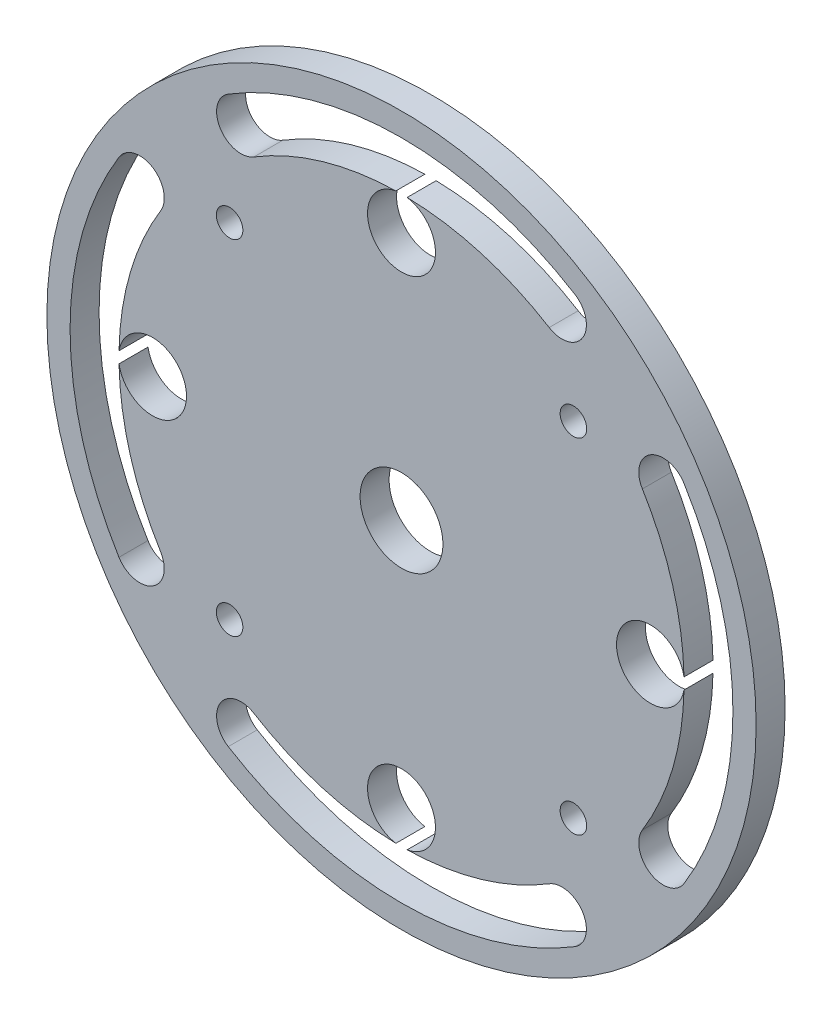
ISO-10303-21;
HEADER;
FILE_DESCRIPTION(('STEP AP214'),'2;1');
FILE_NAME('part.step','',(''),(''),'','','');
FILE_SCHEMA(('AUTOMOTIVE_DESIGN { 1 0 10303 214 1 1 1 1 }'));
ENDSEC;
DATA;
#1=APPLICATION_CONTEXT('core data for automotive mechanical design processes');
#2=APPLICATION_PROTOCOL_DEFINITION('international standard','automotive_design',2000,#1);
#3=PRODUCT_CONTEXT('',#1,'mechanical');
#4=PRODUCT('Part','Part','',(#3));
#5=PRODUCT_RELATED_PRODUCT_CATEGORY('part','',(#4));
#6=PRODUCT_DEFINITION_FORMATION('','',#4);
#7=PRODUCT_DEFINITION_CONTEXT('part definition',#1,'design');
#8=PRODUCT_DEFINITION('design','',#6,#7);
#9=PRODUCT_DEFINITION_SHAPE('','',#8);
#10=(LENGTH_UNIT() NAMED_UNIT(*) SI_UNIT(.MILLI.,.METRE.));
#11=(NAMED_UNIT(*) PLANE_ANGLE_UNIT() SI_UNIT($,.RADIAN.));
#12=(NAMED_UNIT(*) SI_UNIT($,.STERADIAN.) SOLID_ANGLE_UNIT());
#13=UNCERTAINTY_MEASURE_WITH_UNIT(LENGTH_MEASURE(1.E-05),#10,'distance_accuracy_value','');
#14=(GEOMETRIC_REPRESENTATION_CONTEXT(3) GLOBAL_UNCERTAINTY_ASSIGNED_CONTEXT((#13)) GLOBAL_UNIT_ASSIGNED_CONTEXT((#10,
#11,#12)) REPRESENTATION_CONTEXT('',''));
#15=CARTESIAN_POINT('',(0.,0.,0.));
#16=DIRECTION('',(0.,0.,1.));
#17=DIRECTION('',(1.,0.,0.));
#18=AXIS2_PLACEMENT_3D('',#15,#16,#17);
#19=CARTESIAN_POINT('',(0.,0.,48.5));
#20=DIRECTION('',(0.,0.,1.));
#21=DIRECTION('',(1.,0.,0.));
#22=AXIS2_PLACEMENT_3D('',#19,#20,#21);
#23=PLANE('',#22);
#24=CARTESIAN_POINT('',(0.,0.,48.5));
#25=DIRECTION('',(0.,0.,-1.));
#26=DIRECTION('',(-1.,0.,0.));
#27=AXIS2_PLACEMENT_3D('',#24,#25,#26);
#28=CIRCLE('',#27,5.);
#29=CARTESIAN_POINT('',(-5.,0.,48.5));
#30=VERTEX_POINT('',#29);
#31=EDGE_CURVE('E767',#30,#30,#28,.T.);
#32=ORIENTED_EDGE('',*,*,#31,.T.);
#33=EDGE_LOOP('',(#32));
#34=FACE_BOUND('',#33,.T.);
#35=CARTESIAN_POINT('',(-31.585125,19.3670436240118,48.5));
#36=DIRECTION('',(0.,0.,1.));
#37=DIRECTION('',(1.,0.,0.));
#38=AXIS2_PLACEMENT_3D('',#35,#36,#37);
#39=CIRCLE('',#38,2.95);
#40=CARTESIAN_POINT('',(-34.1,20.9090889328062,48.5));
#41=VERTEX_POINT('',#40);
#42=CARTESIAN_POINT('',(-29.07025,17.8249983152173,48.5));
#43=VERTEX_POINT('',#42);
#44=EDGE_CURVE('E206',#41,#43,#39,.F.);
#45=ORIENTED_EDGE('',*,*,#44,.T.);
#46=CARTESIAN_POINT('',(0.,0.,48.5));
#47=DIRECTION('',(0.,0.,1.));
#48=DIRECTION('',(1.,0.,0.));
#49=AXIS2_PLACEMENT_3D('',#46,#47,#48);
#50=CIRCLE('',#49,34.1);
#51=CARTESIAN_POINT('',(-34.0932196339434,0.679981611291357,48.5));
#52=VERTEX_POINT('',#51);
#53=EDGE_CURVE('E224',#43,#52,#50,.T.);
#54=ORIENTED_EDGE('',*,*,#53,.T.);
#55=CARTESIAN_POINT('',(-30.05,0.,48.5));
#56=DIRECTION('',(0.,0.,1.));
#57=DIRECTION('',(1.,0.,0.));
#58=AXIS2_PLACEMENT_3D('',#55,#56,#57);
#59=CIRCLE('',#58,4.1);
#60=CARTESIAN_POINT('',(-34.0932196339434,-0.679981611291435,48.5));
#61=VERTEX_POINT('',#60);
#62=EDGE_CURVE('E399',#61,#52,#59,.T.);
#63=ORIENTED_EDGE('',*,*,#62,.F.);
#64=CARTESIAN_POINT('',(0.,0.,48.5));
#65=DIRECTION('',(0.,0.,1.));
#66=DIRECTION('',(1.,0.,0.));
#67=AXIS2_PLACEMENT_3D('',#64,#65,#66);
#68=CIRCLE('',#67,34.1);
#69=CARTESIAN_POINT('',(-29.07025,-17.8249983152173,48.5));
#70=VERTEX_POINT('',#69);
#71=EDGE_CURVE('E227',#61,#70,#68,.T.);
#72=ORIENTED_EDGE('',*,*,#71,.T.);
#73=CARTESIAN_POINT('',(-31.585125,-19.3670436240118,48.5));
#74=DIRECTION('',(0.,0.,1.));
#75=DIRECTION('',(1.,0.,0.));
#76=AXIS2_PLACEMENT_3D('',#73,#74,#75);
#77=CIRCLE('',#76,2.95);
#78=CARTESIAN_POINT('',(-34.1,-20.9090889328062,48.5));
#79=VERTEX_POINT('',#78);
#80=EDGE_CURVE('E241',#79,#70,#77,.T.);
#81=ORIENTED_EDGE('',*,*,#80,.F.);
#82=CARTESIAN_POINT('',(0.,0.,48.5));
#83=DIRECTION('',(0.,0.,1.));
#84=DIRECTION('',(1.,0.,0.));
#85=AXIS2_PLACEMENT_3D('',#82,#83,#84);
#86=CIRCLE('',#85,40.);
#87=EDGE_CURVE('E238',#41,#79,#86,.T.);
#88=ORIENTED_EDGE('',*,*,#87,.F.);
#89=EDGE_LOOP('',(#45,#54,#63,#72,#81,#88));
#90=FACE_BOUND('',#89,.T.);
#91=CARTESIAN_POINT('',(-19.3670436240118,-31.585125,48.5));
#92=DIRECTION('',(0.,0.,1.));
#93=DIRECTION('',(1.,0.,0.));
#94=AXIS2_PLACEMENT_3D('',#91,#92,#93);
#95=CIRCLE('',#94,2.95);
#96=CARTESIAN_POINT('',(-20.9090889328062,-34.1,48.5));
#97=VERTEX_POINT('',#96);
#98=CARTESIAN_POINT('',(-17.8249983152173,-29.07025,48.5));
#99=VERTEX_POINT('',#98);
#100=EDGE_CURVE('E271',#97,#99,#95,.F.);
#101=ORIENTED_EDGE('',*,*,#100,.T.);
#102=CARTESIAN_POINT('',(0.,0.,48.5));
#103=DIRECTION('',(0.,0.,1.));
#104=DIRECTION('',(1.,0.,0.));
#105=AXIS2_PLACEMENT_3D('',#102,#103,#104);
#106=CIRCLE('',#105,34.1);
#107=CARTESIAN_POINT('',(-0.679981611291352,-34.0932196339434,48.5));
#108=VERTEX_POINT('',#107);
#109=EDGE_CURVE('E260',#99,#108,#106,.T.);
#110=ORIENTED_EDGE('',*,*,#109,.T.);
#111=CARTESIAN_POINT('',(0.,-30.05,48.5));
#112=DIRECTION('',(0.,0.,1.));
#113=DIRECTION('',(1.,0.,0.));
#114=AXIS2_PLACEMENT_3D('',#111,#112,#113);
#115=CIRCLE('',#114,4.1);
#116=CARTESIAN_POINT('',(0.679981611291435,-34.0932196339434,48.5));
#117=VERTEX_POINT('',#116);
#118=EDGE_CURVE('E404',#117,#108,#115,.T.);
#119=ORIENTED_EDGE('',*,*,#118,.F.);
#120=CARTESIAN_POINT('',(0.,0.,48.5));
#121=DIRECTION('',(0.,0.,1.));
#122=DIRECTION('',(1.,0.,0.));
#123=AXIS2_PLACEMENT_3D('',#120,#121,#122);
#124=CIRCLE('',#123,34.1);
#125=CARTESIAN_POINT('',(17.8249983152173,-29.07025,48.5));
#126=VERTEX_POINT('',#125);
#127=EDGE_CURVE('E281',#117,#126,#124,.T.);
#128=ORIENTED_EDGE('',*,*,#127,.T.);
#129=CARTESIAN_POINT('',(19.3670436240118,-31.585125,48.5));
#130=DIRECTION('',(0.,0.,1.));
#131=DIRECTION('',(1.,0.,0.));
#132=AXIS2_PLACEMENT_3D('',#129,#130,#131);
#133=CIRCLE('',#132,2.95);
#134=CARTESIAN_POINT('',(20.9090889328062,-34.1,48.5));
#135=VERTEX_POINT('',#134);
#136=EDGE_CURVE('E278',#135,#126,#133,.T.);
#137=ORIENTED_EDGE('',*,*,#136,.F.);
#138=CARTESIAN_POINT('',(0.,0.,48.5));
#139=DIRECTION('',(0.,0.,1.));
#140=DIRECTION('',(1.,0.,0.));
#141=AXIS2_PLACEMENT_3D('',#138,#139,#140);
#142=CIRCLE('',#141,40.);
#143=EDGE_CURVE('E274',#97,#135,#142,.T.);
#144=ORIENTED_EDGE('',*,*,#143,.F.);
#145=EDGE_LOOP('',(#101,#110,#119,#128,#137,#144));
#146=FACE_BOUND('',#145,.T.);
#147=CARTESIAN_POINT('',(31.585125,-19.3670436240118,48.5));
#148=DIRECTION('',(0.,0.,1.));
#149=DIRECTION('',(1.,0.,0.));
#150=AXIS2_PLACEMENT_3D('',#147,#148,#149);
#151=CIRCLE('',#150,2.95);
#152=CARTESIAN_POINT('',(34.1,-20.9090889328062,48.5));
#153=VERTEX_POINT('',#152);
#154=CARTESIAN_POINT('',(29.07025,-17.8249983152173,48.5));
#155=VERTEX_POINT('',#154);
#156=EDGE_CURVE('E312',#153,#155,#151,.F.);
#157=ORIENTED_EDGE('',*,*,#156,.T.);
#158=CARTESIAN_POINT('',(0.,0.,48.5));
#159=DIRECTION('',(0.,0.,1.));
#160=DIRECTION('',(1.,0.,0.));
#161=AXIS2_PLACEMENT_3D('',#158,#159,#160);
#162=CIRCLE('',#161,34.1);
#163=CARTESIAN_POINT('',(34.0932196339434,-0.679981611291357,48.5));
#164=VERTEX_POINT('',#163);
#165=EDGE_CURVE('E301',#155,#164,#162,.T.);
#166=ORIENTED_EDGE('',*,*,#165,.T.);
#167=CARTESIAN_POINT('',(30.05,0.,48.5));
#168=DIRECTION('',(0.,0.,1.));
#169=DIRECTION('',(1.,0.,0.));
#170=AXIS2_PLACEMENT_3D('',#167,#168,#169);
#171=CIRCLE('',#170,4.1);
#172=CARTESIAN_POINT('',(34.0932196339434,0.679981611291435,48.5));
#173=VERTEX_POINT('',#172);
#174=EDGE_CURVE('E410',#173,#164,#171,.T.);
#175=ORIENTED_EDGE('',*,*,#174,.F.);
#176=CARTESIAN_POINT('',(0.,0.,48.5));
#177=DIRECTION('',(0.,0.,1.));
#178=DIRECTION('',(1.,0.,0.));
#179=AXIS2_PLACEMENT_3D('',#176,#177,#178);
#180=CIRCLE('',#179,34.1);
#181=CARTESIAN_POINT('',(29.07025,17.8249983152173,48.5));
#182=VERTEX_POINT('',#181);
#183=EDGE_CURVE('E60',#173,#182,#180,.T.);
#184=ORIENTED_EDGE('',*,*,#183,.T.);
#185=CARTESIAN_POINT('',(31.585125,19.3670436240118,48.5));
#186=DIRECTION('',(0.,0.,1.));
#187=DIRECTION('',(1.,0.,0.));
#188=AXIS2_PLACEMENT_3D('',#185,#186,#187);
#189=CIRCLE('',#188,2.95);
#190=CARTESIAN_POINT('',(34.1,20.9090889328062,48.5));
#191=VERTEX_POINT('',#190);
#192=EDGE_CURVE('E319',#191,#182,#189,.T.);
#193=ORIENTED_EDGE('',*,*,#192,.F.);
#194=CARTESIAN_POINT('',(0.,0.,48.5));
#195=DIRECTION('',(0.,0.,1.));
#196=DIRECTION('',(1.,0.,0.));
#197=AXIS2_PLACEMENT_3D('',#194,#195,#196);
#198=CIRCLE('',#197,40.);
#199=EDGE_CURVE('E315',#153,#191,#198,.T.);
#200=ORIENTED_EDGE('',*,*,#199,.F.);
#201=EDGE_LOOP('',(#157,#166,#175,#184,#193,#200));
#202=FACE_BOUND('',#201,.T.);
#203=CARTESIAN_POINT('',(0.,30.05,48.5));
#204=DIRECTION('',(0.,0.,1.));
#205=DIRECTION('',(1.,0.,0.));
#206=AXIS2_PLACEMENT_3D('',#203,#204,#205);
#207=CIRCLE('',#206,4.1);
#208=CARTESIAN_POINT('',(-0.67998161129135,34.0932196339434,48.5));
#209=VERTEX_POINT('',#208);
#210=CARTESIAN_POINT('',(0.679981611291354,34.0932196339434,48.5));
#211=VERTEX_POINT('',#210);
#212=EDGE_CURVE('E11',#209,#211,#207,.T.);
#213=ORIENTED_EDGE('',*,*,#212,.F.);
#214=CARTESIAN_POINT('',(0.,0.,48.5));
#215=DIRECTION('',(0.,0.,1.));
#216=DIRECTION('',(1.,0.,0.));
#217=AXIS2_PLACEMENT_3D('',#214,#215,#216);
#218=CIRCLE('',#217,34.1);
#219=CARTESIAN_POINT('',(-17.8249983152173,29.07025,48.5));
#220=VERTEX_POINT('',#219);
#221=EDGE_CURVE('E338',#209,#220,#218,.T.);
#222=ORIENTED_EDGE('',*,*,#221,.T.);
#223=CARTESIAN_POINT('',(-19.3670436240118,31.585125,48.5));
#224=DIRECTION('',(0.,0.,1.));
#225=DIRECTION('',(1.,0.,0.));
#226=AXIS2_PLACEMENT_3D('',#223,#224,#225);
#227=CIRCLE('',#226,2.95);
#228=CARTESIAN_POINT('',(-20.9090889328062,34.1,48.5));
#229=VERTEX_POINT('',#228);
#230=EDGE_CURVE('E359',#229,#220,#227,.T.);
#231=ORIENTED_EDGE('',*,*,#230,.F.);
#232=CARTESIAN_POINT('',(0.,0.,48.5));
#233=DIRECTION('',(0.,0.,1.));
#234=DIRECTION('',(1.,0.,0.));
#235=AXIS2_PLACEMENT_3D('',#232,#233,#234);
#236=CIRCLE('',#235,40.);
#237=CARTESIAN_POINT('',(20.9090889328062,34.1,48.5));
#238=VERTEX_POINT('',#237);
#239=EDGE_CURVE('E356',#238,#229,#236,.T.);
#240=ORIENTED_EDGE('',*,*,#239,.F.);
#241=CARTESIAN_POINT('',(19.3670436240118,31.585125,48.5));
#242=DIRECTION('',(0.,0.,1.));
#243=DIRECTION('',(1.,0.,0.));
#244=AXIS2_PLACEMENT_3D('',#241,#242,#243);
#245=CIRCLE('',#244,2.95);
#246=CARTESIAN_POINT('',(17.8249983152173,29.07025,48.5));
#247=VERTEX_POINT('',#246);
#248=EDGE_CURVE('E352',#238,#247,#245,.F.);
#249=ORIENTED_EDGE('',*,*,#248,.T.);
#250=CARTESIAN_POINT('',(0.,0.,48.5));
#251=DIRECTION('',(0.,0.,1.));
#252=DIRECTION('',(1.,0.,0.));
#253=AXIS2_PLACEMENT_3D('',#250,#251,#252);
#254=CIRCLE('',#253,34.1);
#255=EDGE_CURVE('E349',#247,#211,#254,.T.);
#256=ORIENTED_EDGE('',*,*,#255,.T.);
#257=EDGE_LOOP('',(#213,#222,#231,#240,#249,#256));
#258=FACE_BOUND('',#257,.T.);
#259=CARTESIAN_POINT('',(-20.7462044013181,-20.7462044013181,48.5));
#260=DIRECTION('',(0.,0.,1.));
#261=DIRECTION('',(1.,0.,0.));
#262=AXIS2_PLACEMENT_3D('',#259,#260,#261);
#263=CIRCLE('',#262,1.6);
#264=CARTESIAN_POINT('',(-19.1462044013181,-20.7462044013181,48.5));
#265=VERTEX_POINT('',#264);
#266=EDGE_CURVE('E375',#265,#265,#263,.T.);
#267=ORIENTED_EDGE('',*,*,#266,.F.);
#268=EDGE_LOOP('',(#267));
#269=FACE_BOUND('',#268,.T.);
#270=CARTESIAN_POINT('',(20.7462044013181,20.7462044013181,48.5));
#271=DIRECTION('',(0.,0.,1.));
#272=DIRECTION('',(1.,0.,0.));
#273=AXIS2_PLACEMENT_3D('',#270,#271,#272);
#274=CIRCLE('',#273,1.6);
#275=CARTESIAN_POINT('',(22.3462044013181,20.7462044013181,48.5));
#276=VERTEX_POINT('',#275);
#277=EDGE_CURVE('E387',#276,#276,#274,.T.);
#278=ORIENTED_EDGE('',*,*,#277,.F.);
#279=EDGE_LOOP('',(#278));
#280=FACE_BOUND('',#279,.T.);
#281=CARTESIAN_POINT('',(-20.7462044013181,20.7462044013181,48.5));
#282=DIRECTION('',(0.,0.,1.));
#283=DIRECTION('',(1.,0.,0.));
#284=AXIS2_PLACEMENT_3D('',#281,#282,#283);
#285=CIRCLE('',#284,1.6);
#286=CARTESIAN_POINT('',(-19.1462044013181,20.7462044013181,48.5));
#287=VERTEX_POINT('',#286);
#288=EDGE_CURVE('E393',#287,#287,#285,.T.);
#289=ORIENTED_EDGE('',*,*,#288,.F.);
#290=EDGE_LOOP('',(#289));
#291=FACE_BOUND('',#290,.T.);
#292=CARTESIAN_POINT('',(20.7462044013181,-20.7462044013181,48.5));
#293=DIRECTION('',(0.,0.,1.));
#294=DIRECTION('',(1.,0.,0.));
#295=AXIS2_PLACEMENT_3D('',#292,#293,#294);
#296=CIRCLE('',#295,1.6);
#297=CARTESIAN_POINT('',(22.3462044013181,-20.7462044013181,48.5));
#298=VERTEX_POINT('',#297);
#299=EDGE_CURVE('E381',#298,#298,#296,.T.);
#300=ORIENTED_EDGE('',*,*,#299,.F.);
#301=EDGE_LOOP('',(#300));
#302=FACE_BOUND('',#301,.T.);
#303=CARTESIAN_POINT('',(0.,0.,48.5));
#304=DIRECTION('',(0.,0.,-1.));
#305=DIRECTION('',(-1.,0.,0.));
#306=AXIS2_PLACEMENT_3D('',#303,#304,#305);
#307=CIRCLE('',#306,42.8);
#308=CARTESIAN_POINT('',(-42.8,0.,48.5));
#309=VERTEX_POINT('',#308);
#310=EDGE_CURVE('E353',#309,#309,#307,.T.);
#311=ORIENTED_EDGE('',*,*,#310,.F.);
#312=EDGE_LOOP('',(#311));
#313=FACE_BOUND('',#312,.T.);
#314=ADVANCED_FACE('F37',(#34,#90,#146,#202,#258,#269,#280,#291,#302,#313),#23,.T.);
#315=CARTESIAN_POINT('',(0.,0.,45.));
#316=DIRECTION('',(0.,0.,1.));
#317=DIRECTION('',(1.,0.,0.));
#318=AXIS2_PLACEMENT_3D('',#315,#316,#317);
#319=PLANE('',#318);
#320=CARTESIAN_POINT('',(0.,0.,45.));
#321=DIRECTION('',(0.,0.,-1.));
#322=DIRECTION('',(-1.,0.,0.));
#323=AXIS2_PLACEMENT_3D('',#320,#321,#322);
#324=CIRCLE('',#323,5.);
#325=CARTESIAN_POINT('',(-5.,0.,45.));
#326=VERTEX_POINT('',#325);
#327=EDGE_CURVE('E769',#326,#326,#324,.T.);
#328=ORIENTED_EDGE('',*,*,#327,.F.);
#329=EDGE_LOOP('',(#328));
#330=FACE_BOUND('',#329,.T.);
#331=CARTESIAN_POINT('',(0.,0.,45.));
#332=DIRECTION('',(0.,0.,1.));
#333=DIRECTION('',(1.,0.,0.));
#334=AXIS2_PLACEMENT_3D('',#331,#332,#333);
#335=CIRCLE('',#334,34.1);
#336=CARTESIAN_POINT('',(-29.07025,17.8249983152173,45.));
#337=VERTEX_POINT('',#336);
#338=CARTESIAN_POINT('',(-34.0932196339434,0.679981611291357,45.));
#339=VERTEX_POINT('',#338);
#340=EDGE_CURVE('E211',#337,#339,#335,.T.);
#341=ORIENTED_EDGE('',*,*,#340,.F.);
#342=CARTESIAN_POINT('',(-31.585125,19.3670436240118,45.));
#343=DIRECTION('',(0.,0.,1.));
#344=DIRECTION('',(1.,0.,0.));
#345=AXIS2_PLACEMENT_3D('',#342,#343,#344);
#346=CIRCLE('',#345,2.95);
#347=CARTESIAN_POINT('',(-34.1,20.9090889328062,45.));
#348=VERTEX_POINT('',#347);
#349=EDGE_CURVE('E203',#348,#337,#346,.F.);
#350=ORIENTED_EDGE('',*,*,#349,.F.);
#351=CARTESIAN_POINT('',(0.,0.,45.));
#352=DIRECTION('',(0.,0.,1.));
#353=DIRECTION('',(1.,0.,0.));
#354=AXIS2_PLACEMENT_3D('',#351,#352,#353);
#355=CIRCLE('',#354,40.);
#356=CARTESIAN_POINT('',(-34.1,-20.9090889328062,45.));
#357=VERTEX_POINT('',#356);
#358=EDGE_CURVE('E214',#348,#357,#355,.T.);
#359=ORIENTED_EDGE('',*,*,#358,.T.);
#360=CARTESIAN_POINT('',(-31.585125,-19.3670436240118,45.));
#361=DIRECTION('',(0.,0.,1.));
#362=DIRECTION('',(1.,0.,0.));
#363=AXIS2_PLACEMENT_3D('',#360,#361,#362);
#364=CIRCLE('',#363,2.95);
#365=CARTESIAN_POINT('',(-29.07025,-17.8249983152173,45.));
#366=VERTEX_POINT('',#365);
#367=EDGE_CURVE('E219',#357,#366,#364,.T.);
#368=ORIENTED_EDGE('',*,*,#367,.T.);
#369=CARTESIAN_POINT('',(0.,0.,45.));
#370=DIRECTION('',(0.,0.,1.));
#371=DIRECTION('',(1.,0.,0.));
#372=AXIS2_PLACEMENT_3D('',#369,#370,#371);
#373=CIRCLE('',#372,34.1);
#374=CARTESIAN_POINT('',(-34.0932196339434,-0.679981611291357,45.));
#375=VERTEX_POINT('',#374);
#376=EDGE_CURVE('E234',#375,#366,#373,.T.);
#377=ORIENTED_EDGE('',*,*,#376,.F.);
#378=CARTESIAN_POINT('',(-30.05,0.,45.));
#379=DIRECTION('',(0.,0.,1.));
#380=DIRECTION('',(1.,0.,0.));
#381=AXIS2_PLACEMENT_3D('',#378,#379,#380);
#382=CIRCLE('',#381,4.1);
#383=EDGE_CURVE('E396',#375,#339,#382,.T.);
#384=ORIENTED_EDGE('',*,*,#383,.T.);
#385=EDGE_LOOP('',(#341,#350,#359,#368,#377,#384));
#386=FACE_BOUND('',#385,.T.);
#387=CARTESIAN_POINT('',(0.,0.,45.));
#388=DIRECTION('',(0.,0.,1.));
#389=DIRECTION('',(1.,0.,0.));
#390=AXIS2_PLACEMENT_3D('',#387,#388,#389);
#391=CIRCLE('',#390,34.1);
#392=CARTESIAN_POINT('',(29.07025,-17.8249983152173,45.));
#393=VERTEX_POINT('',#392);
#394=CARTESIAN_POINT('',(34.0932196339434,-0.679981611291357,45.));
#395=VERTEX_POINT('',#394);
#396=EDGE_CURVE('E309',#393,#395,#391,.T.);
#397=ORIENTED_EDGE('',*,*,#396,.F.);
#398=CARTESIAN_POINT('',(31.585125,-19.3670436240118,45.));
#399=DIRECTION('',(0.,0.,1.));
#400=DIRECTION('',(1.,0.,0.));
#401=AXIS2_PLACEMENT_3D('',#398,#399,#400);
#402=CIRCLE('',#401,2.95);
#403=CARTESIAN_POINT('',(34.1,-20.9090889328062,45.));
#404=VERTEX_POINT('',#403);
#405=EDGE_CURVE('E298',#404,#393,#402,.F.);
#406=ORIENTED_EDGE('',*,*,#405,.F.);
#407=CARTESIAN_POINT('',(0.,0.,45.));
#408=DIRECTION('',(0.,0.,1.));
#409=DIRECTION('',(1.,0.,0.));
#410=AXIS2_PLACEMENT_3D('',#407,#408,#409);
#411=CIRCLE('',#410,40.);
#412=CARTESIAN_POINT('',(34.1,20.9090889328062,45.));
#413=VERTEX_POINT('',#412);
#414=EDGE_CURVE('E300',#404,#413,#411,.T.);
#415=ORIENTED_EDGE('',*,*,#414,.T.);
#416=CARTESIAN_POINT('',(31.585125,19.3670436240118,45.));
#417=DIRECTION('',(0.,0.,1.));
#418=DIRECTION('',(1.,0.,0.));
#419=AXIS2_PLACEMENT_3D('',#416,#417,#418);
#420=CIRCLE('',#419,2.95);
#421=CARTESIAN_POINT('',(29.07025,17.8249983152173,45.));
#422=VERTEX_POINT('',#421);
#423=EDGE_CURVE('E304',#413,#422,#420,.T.);
#424=ORIENTED_EDGE('',*,*,#423,.T.);
#425=CARTESIAN_POINT('',(0.,0.,45.));
#426=DIRECTION('',(0.,0.,1.));
#427=DIRECTION('',(1.,0.,0.));
#428=AXIS2_PLACEMENT_3D('',#425,#426,#427);
#429=CIRCLE('',#428,34.1);
#430=CARTESIAN_POINT('',(34.0932196339434,0.679981611291357,45.));
#431=VERTEX_POINT('',#430);
#432=EDGE_CURVE('E307',#431,#422,#429,.T.);
#433=ORIENTED_EDGE('',*,*,#432,.F.);
#434=CARTESIAN_POINT('',(30.05,0.,45.));
#435=DIRECTION('',(0.,0.,1.));
#436=DIRECTION('',(1.,0.,0.));
#437=AXIS2_PLACEMENT_3D('',#434,#435,#436);
#438=CIRCLE('',#437,4.1);
#439=EDGE_CURVE('E407',#431,#395,#438,.T.);
#440=ORIENTED_EDGE('',*,*,#439,.T.);
#441=EDGE_LOOP('',(#397,#406,#415,#424,#433,#440));
#442=FACE_BOUND('',#441,.T.);
#443=CARTESIAN_POINT('',(-20.7462044013181,-20.7462044013181,45.));
#444=DIRECTION('',(0.,0.,1.));
#445=DIRECTION('',(1.,0.,0.));
#446=AXIS2_PLACEMENT_3D('',#443,#444,#445);
#447=CIRCLE('',#446,1.6);
#448=CARTESIAN_POINT('',(-19.1462044013181,-20.7462044013181,45.));
#449=VERTEX_POINT('',#448);
#450=EDGE_CURVE('E248',#449,#449,#447,.T.);
#451=ORIENTED_EDGE('',*,*,#450,.T.);
#452=EDGE_LOOP('',(#451));
#453=FACE_BOUND('',#452,.T.);
#454=CARTESIAN_POINT('',(20.7462044013181,-20.7462044013181,45.));
#455=DIRECTION('',(0.,0.,1.));
#456=DIRECTION('',(1.,0.,0.));
#457=AXIS2_PLACEMENT_3D('',#454,#455,#456);
#458=CIRCLE('',#457,1.6);
#459=CARTESIAN_POINT('',(22.3462044013181,-20.7462044013181,45.));
#460=VERTEX_POINT('',#459);
#461=EDGE_CURVE('E378',#460,#460,#458,.T.);
#462=ORIENTED_EDGE('',*,*,#461,.T.);
#463=EDGE_LOOP('',(#462));
#464=FACE_BOUND('',#463,.T.);
#465=CARTESIAN_POINT('',(20.7462044013181,20.7462044013181,45.));
#466=DIRECTION('',(0.,0.,1.));
#467=DIRECTION('',(1.,0.,0.));
#468=AXIS2_PLACEMENT_3D('',#465,#466,#467);
#469=CIRCLE('',#468,1.6);
#470=CARTESIAN_POINT('',(22.3462044013181,20.7462044013181,45.));
#471=VERTEX_POINT('',#470);
#472=EDGE_CURVE('E384',#471,#471,#469,.T.);
#473=ORIENTED_EDGE('',*,*,#472,.T.);
#474=EDGE_LOOP('',(#473));
#475=FACE_BOUND('',#474,.T.);
#476=CARTESIAN_POINT('',(-20.7462044013181,20.7462044013181,45.));
#477=DIRECTION('',(0.,0.,1.));
#478=DIRECTION('',(1.,0.,0.));
#479=AXIS2_PLACEMENT_3D('',#476,#477,#478);
#480=CIRCLE('',#479,1.6);
#481=CARTESIAN_POINT('',(-19.1462044013181,20.7462044013181,45.));
#482=VERTEX_POINT('',#481);
#483=EDGE_CURVE('E390',#482,#482,#480,.T.);
#484=ORIENTED_EDGE('',*,*,#483,.T.);
#485=EDGE_LOOP('',(#484));
#486=FACE_BOUND('',#485,.T.);
#487=CARTESIAN_POINT('',(0.,0.,45.));
#488=DIRECTION('',(0.,0.,1.));
#489=DIRECTION('',(1.,0.,0.));
#490=AXIS2_PLACEMENT_3D('',#487,#488,#489);
#491=CIRCLE('',#490,34.1);
#492=CARTESIAN_POINT('',(-0.67998161129135,34.0932196339434,45.));
#493=VERTEX_POINT('',#492);
#494=CARTESIAN_POINT('',(-17.8249983152173,29.07025,45.));
#495=VERTEX_POINT('',#494);
#496=EDGE_CURVE('E346',#493,#495,#491,.T.);
#497=ORIENTED_EDGE('',*,*,#496,.F.);
#498=CARTESIAN_POINT('',(0.,30.05,45.));
#499=DIRECTION('',(0.,0.,1.));
#500=DIRECTION('',(1.,0.,0.));
#501=AXIS2_PLACEMENT_3D('',#498,#499,#500);
#502=CIRCLE('',#501,4.1);
#503=CARTESIAN_POINT('',(0.679981611291354,34.0932196339434,45.));
#504=VERTEX_POINT('',#503);
#505=EDGE_CURVE('E41',#493,#504,#502,.T.);
#506=ORIENTED_EDGE('',*,*,#505,.T.);
#507=CARTESIAN_POINT('',(0.,0.,45.));
#508=DIRECTION('',(0.,0.,1.));
#509=DIRECTION('',(1.,0.,0.));
#510=AXIS2_PLACEMENT_3D('',#507,#508,#509);
#511=CIRCLE('',#510,34.1);
#512=CARTESIAN_POINT('',(17.8249983152173,29.07025,45.));
#513=VERTEX_POINT('',#512);
#514=EDGE_CURVE('E52',#513,#504,#511,.T.);
#515=ORIENTED_EDGE('',*,*,#514,.F.);
#516=CARTESIAN_POINT('',(19.3670436240118,31.585125,45.));
#517=DIRECTION('',(0.,0.,1.));
#518=DIRECTION('',(1.,0.,0.));
#519=AXIS2_PLACEMENT_3D('',#516,#517,#518);
#520=CIRCLE('',#519,2.95);
#521=CARTESIAN_POINT('',(20.9090889328062,34.1,45.));
#522=VERTEX_POINT('',#521);
#523=EDGE_CURVE('E337',#522,#513,#520,.F.);
#524=ORIENTED_EDGE('',*,*,#523,.F.);
#525=CARTESIAN_POINT('',(0.,0.,45.));
#526=DIRECTION('',(0.,0.,1.));
#527=DIRECTION('',(1.,0.,0.));
#528=AXIS2_PLACEMENT_3D('',#525,#526,#527);
#529=CIRCLE('',#528,40.);
#530=CARTESIAN_POINT('',(-20.9090889328062,34.1,45.));
#531=VERTEX_POINT('',#530);
#532=EDGE_CURVE('E340',#522,#531,#529,.T.);
#533=ORIENTED_EDGE('',*,*,#532,.T.);
#534=CARTESIAN_POINT('',(-19.3670436240118,31.585125,45.));
#535=DIRECTION('',(0.,0.,1.));
#536=DIRECTION('',(1.,0.,0.));
#537=AXIS2_PLACEMENT_3D('',#534,#535,#536);
#538=CIRCLE('',#537,2.95);
#539=EDGE_CURVE('E343',#531,#495,#538,.T.);
#540=ORIENTED_EDGE('',*,*,#539,.T.);
#541=EDGE_LOOP('',(#497,#506,#515,#524,#533,#540));
#542=FACE_BOUND('',#541,.T.);
#543=CARTESIAN_POINT('',(0.,0.,45.));
#544=DIRECTION('',(0.,0.,1.));
#545=DIRECTION('',(1.,0.,0.));
#546=AXIS2_PLACEMENT_3D('',#543,#544,#545);
#547=CIRCLE('',#546,34.1);
#548=CARTESIAN_POINT('',(-17.8249983152173,-29.07025,45.));
#549=VERTEX_POINT('',#548);
#550=CARTESIAN_POINT('',(-0.679981611291352,-34.0932196339434,45.));
#551=VERTEX_POINT('',#550);
#552=EDGE_CURVE('E268',#549,#551,#547,.T.);
#553=ORIENTED_EDGE('',*,*,#552,.F.);
#554=CARTESIAN_POINT('',(-19.3670436240118,-31.585125,45.));
#555=DIRECTION('',(0.,0.,1.));
#556=DIRECTION('',(1.,0.,0.));
#557=AXIS2_PLACEMENT_3D('',#554,#555,#556);
#558=CIRCLE('',#557,2.95);
#559=CARTESIAN_POINT('',(-20.9090889328062,-34.1,45.));
#560=VERTEX_POINT('',#559);
#561=EDGE_CURVE('E257',#560,#549,#558,.F.);
#562=ORIENTED_EDGE('',*,*,#561,.F.);
#563=CARTESIAN_POINT('',(0.,0.,45.));
#564=DIRECTION('',(0.,0.,1.));
#565=DIRECTION('',(1.,0.,0.));
#566=AXIS2_PLACEMENT_3D('',#563,#564,#565);
#567=CIRCLE('',#566,40.);
#568=CARTESIAN_POINT('',(20.9090889328062,-34.1,45.));
#569=VERTEX_POINT('',#568);
#570=EDGE_CURVE('E259',#560,#569,#567,.T.);
#571=ORIENTED_EDGE('',*,*,#570,.T.);
#572=CARTESIAN_POINT('',(19.3670436240118,-31.585125,45.));
#573=DIRECTION('',(0.,0.,1.));
#574=DIRECTION('',(1.,0.,0.));
#575=AXIS2_PLACEMENT_3D('',#572,#573,#574);
#576=CIRCLE('',#575,2.95);
#577=CARTESIAN_POINT('',(17.8249983152173,-29.07025,45.));
#578=VERTEX_POINT('',#577);
#579=EDGE_CURVE('E263',#569,#578,#576,.T.);
#580=ORIENTED_EDGE('',*,*,#579,.T.);
#581=CARTESIAN_POINT('',(0.,0.,45.));
#582=DIRECTION('',(0.,0.,1.));
#583=DIRECTION('',(1.,0.,0.));
#584=AXIS2_PLACEMENT_3D('',#581,#582,#583);
#585=CIRCLE('',#584,34.1);
#586=CARTESIAN_POINT('',(0.679981611291352,-34.0932196339434,45.));
#587=VERTEX_POINT('',#586);
#588=EDGE_CURVE('E266',#587,#578,#585,.T.);
#589=ORIENTED_EDGE('',*,*,#588,.F.);
#590=CARTESIAN_POINT('',(0.,-30.05,45.));
#591=DIRECTION('',(0.,0.,1.));
#592=DIRECTION('',(1.,0.,0.));
#593=AXIS2_PLACEMENT_3D('',#590,#591,#592);
#594=CIRCLE('',#593,4.1);
#595=EDGE_CURVE('E402',#587,#551,#594,.T.);
#596=ORIENTED_EDGE('',*,*,#595,.T.);
#597=EDGE_LOOP('',(#553,#562,#571,#580,#589,#596));
#598=FACE_BOUND('',#597,.T.);
#599=CARTESIAN_POINT('',(0.,0.,45.));
#600=DIRECTION('',(0.,0.,-1.));
#601=DIRECTION('',(-1.,0.,0.));
#602=AXIS2_PLACEMENT_3D('',#599,#600,#601);
#603=CIRCLE('',#602,42.8);
#604=CARTESIAN_POINT('',(-42.8,0.,45.));
#605=VERTEX_POINT('',#604);
#606=EDGE_CURVE('E230',#605,#605,#603,.T.);
#607=ORIENTED_EDGE('',*,*,#606,.T.);
#608=EDGE_LOOP('',(#607));
#609=FACE_BOUND('',#608,.T.);
#610=ADVANCED_FACE('F39',(#330,#386,#442,#453,#464,#475,#486,#542,#598,#609),#319,.F.);
#611=CARTESIAN_POINT('',(0.,30.05,48.5));
#612=DIRECTION('',(0.,0.,-1.));
#613=DIRECTION('',(-1.,0.,0.));
#614=AXIS2_PLACEMENT_3D('',#611,#612,#613);
#615=CYLINDRICAL_SURFACE('',#614,4.1);
#616=ORIENTED_EDGE('',*,*,#505,.F.);
#617=DIRECTION('',(0.,0.,1.));
#618=VECTOR('',#617,1.);
#619=CARTESIAN_POINT('',(-0.67998161129135,34.0932196339434,45.));
#620=LINE('',#619,#618);
#621=EDGE_CURVE('E316',#493,#209,#620,.T.);
#622=ORIENTED_EDGE('',*,*,#621,.T.);
#623=ORIENTED_EDGE('',*,*,#212,.T.);
#624=DIRECTION('',(0.,0.,1.));
#625=VECTOR('',#624,1.);
#626=CARTESIAN_POINT('',(0.679981611291354,34.0932196339434,45.));
#627=LINE('',#626,#625);
#628=EDGE_CURVE('E348',#504,#211,#627,.T.);
#629=ORIENTED_EDGE('',*,*,#628,.F.);
#630=EDGE_LOOP('',(#616,#622,#623,#629));
#631=FACE_BOUND('',#630,.T.);
#632=ADVANCED_FACE('F454',(#631),#615,.F.);
#633=CARTESIAN_POINT('',(30.05,0.,48.5));
#634=DIRECTION('',(0.,0.,-1.));
#635=DIRECTION('',(-1.,0.,0.));
#636=AXIS2_PLACEMENT_3D('',#633,#634,#635);
#637=CYLINDRICAL_SURFACE('',#636,4.1);
#638=ORIENTED_EDGE('',*,*,#174,.T.);
#639=DIRECTION('',(0.,0.,1.));
#640=VECTOR('',#639,1.);
#641=CARTESIAN_POINT('',(34.0932196339434,-0.679981611291357,45.));
#642=LINE('',#641,#640);
#643=EDGE_CURVE('E327',#395,#164,#642,.T.);
#644=ORIENTED_EDGE('',*,*,#643,.F.);
#645=ORIENTED_EDGE('',*,*,#439,.F.);
#646=DIRECTION('',(0.,0.,1.));
#647=VECTOR('',#646,1.);
#648=CARTESIAN_POINT('',(34.0932196339434,0.679981611291357,45.));
#649=LINE('',#648,#647);
#650=EDGE_CURVE('E329',#431,#173,#649,.T.);
#651=ORIENTED_EDGE('',*,*,#650,.T.);
#652=EDGE_LOOP('',(#638,#644,#645,#651));
#653=FACE_BOUND('',#652,.T.);
#654=ADVANCED_FACE('F421',(#653),#637,.F.);
#655=CARTESIAN_POINT('',(0.,-30.05,48.5));
#656=DIRECTION('',(0.,0.,-1.));
#657=DIRECTION('',(-1.,0.,0.));
#658=AXIS2_PLACEMENT_3D('',#655,#656,#657);
#659=CYLINDRICAL_SURFACE('',#658,4.1);
#660=ORIENTED_EDGE('',*,*,#118,.T.);
#661=DIRECTION('',(0.,0.,1.));
#662=VECTOR('',#661,1.);
#663=CARTESIAN_POINT('',(-0.679981611291352,-34.0932196339434,45.));
#664=LINE('',#663,#662);
#665=EDGE_CURVE('E288',#551,#108,#664,.T.);
#666=ORIENTED_EDGE('',*,*,#665,.F.);
#667=ORIENTED_EDGE('',*,*,#595,.F.);
#668=DIRECTION('',(0.,0.,1.));
#669=VECTOR('',#668,1.);
#670=CARTESIAN_POINT('',(0.679981611291352,-34.0932196339434,45.));
#671=LINE('',#670,#669);
#672=EDGE_CURVE('E290',#587,#117,#671,.T.);
#673=ORIENTED_EDGE('',*,*,#672,.T.);
#674=EDGE_LOOP('',(#660,#666,#667,#673));
#675=FACE_BOUND('',#674,.T.);
#676=ADVANCED_FACE('F464',(#675),#659,.F.);
#677=CARTESIAN_POINT('',(-30.05,0.,48.5));
#678=DIRECTION('',(0.,0.,-1.));
#679=DIRECTION('',(-1.,0.,0.));
#680=AXIS2_PLACEMENT_3D('',#677,#678,#679);
#681=CYLINDRICAL_SURFACE('',#680,4.1);
#682=ORIENTED_EDGE('',*,*,#62,.T.);
#683=DIRECTION('',(0.,0.,1.));
#684=VECTOR('',#683,1.);
#685=CARTESIAN_POINT('',(-34.0932196339434,0.679981611291357,45.));
#686=LINE('',#685,#684);
#687=EDGE_CURVE('E249',#339,#52,#686,.T.);
#688=ORIENTED_EDGE('',*,*,#687,.F.);
#689=ORIENTED_EDGE('',*,*,#383,.F.);
#690=DIRECTION('',(0.,0.,1.));
#691=VECTOR('',#690,1.);
#692=CARTESIAN_POINT('',(-34.0932196339434,-0.679981611291357,45.));
#693=LINE('',#692,#691);
#694=EDGE_CURVE('E251',#375,#61,#693,.T.);
#695=ORIENTED_EDGE('',*,*,#694,.T.);
#696=EDGE_LOOP('',(#682,#688,#689,#695));
#697=FACE_BOUND('',#696,.T.);
#698=ADVANCED_FACE('F467',(#697),#681,.F.);
#699=CARTESIAN_POINT('',(-20.7462044013181,20.7462044013181,48.5));
#700=DIRECTION('',(0.,0.,-1.));
#701=DIRECTION('',(-1.,0.,0.));
#702=AXIS2_PLACEMENT_3D('',#699,#700,#701);
#703=CYLINDRICAL_SURFACE('',#702,1.6);
#704=ORIENTED_EDGE('',*,*,#288,.T.);
#705=EDGE_LOOP('',(#704));
#706=FACE_BOUND('',#705,.T.);
#707=ORIENTED_EDGE('',*,*,#483,.F.);
#708=EDGE_LOOP('',(#707));
#709=FACE_BOUND('',#708,.T.);
#710=ADVANCED_FACE('F471',(#706,#709),#703,.F.);
#711=CARTESIAN_POINT('',(20.7462044013181,20.7462044013181,48.5));
#712=DIRECTION('',(0.,0.,-1.));
#713=DIRECTION('',(-1.,0.,0.));
#714=AXIS2_PLACEMENT_3D('',#711,#712,#713);
#715=CYLINDRICAL_SURFACE('',#714,1.6);
#716=ORIENTED_EDGE('',*,*,#277,.T.);
#717=EDGE_LOOP('',(#716));
#718=FACE_BOUND('',#717,.T.);
#719=ORIENTED_EDGE('',*,*,#472,.F.);
#720=EDGE_LOOP('',(#719));
#721=FACE_BOUND('',#720,.T.);
#722=ADVANCED_FACE('F475',(#718,#721),#715,.F.);
#723=CARTESIAN_POINT('',(20.7462044013181,-20.7462044013181,48.5));
#724=DIRECTION('',(0.,0.,-1.));
#725=DIRECTION('',(-1.,0.,0.));
#726=AXIS2_PLACEMENT_3D('',#723,#724,#725);
#727=CYLINDRICAL_SURFACE('',#726,1.6);
#728=ORIENTED_EDGE('',*,*,#299,.T.);
#729=EDGE_LOOP('',(#728));
#730=FACE_BOUND('',#729,.T.);
#731=ORIENTED_EDGE('',*,*,#461,.F.);
#732=EDGE_LOOP('',(#731));
#733=FACE_BOUND('',#732,.T.);
#734=ADVANCED_FACE('F479',(#730,#733),#727,.F.);
#735=CARTESIAN_POINT('',(-20.7462044013181,-20.7462044013181,48.5));
#736=DIRECTION('',(0.,0.,-1.));
#737=DIRECTION('',(-1.,0.,0.));
#738=AXIS2_PLACEMENT_3D('',#735,#736,#737);
#739=CYLINDRICAL_SURFACE('',#738,1.6);
#740=ORIENTED_EDGE('',*,*,#266,.T.);
#741=EDGE_LOOP('',(#740));
#742=FACE_BOUND('',#741,.T.);
#743=ORIENTED_EDGE('',*,*,#450,.F.);
#744=EDGE_LOOP('',(#743));
#745=FACE_BOUND('',#744,.T.);
#746=ADVANCED_FACE('F483',(#742,#745),#739,.F.);
#747=CARTESIAN_POINT('',(-31.585125,19.3670436240118,45.));
#748=DIRECTION('',(0.,0.,1.));
#749=DIRECTION('',(1.,0.,0.));
#750=AXIS2_PLACEMENT_3D('',#747,#748,#749);
#751=CYLINDRICAL_SURFACE('',#750,2.95);
#752=ORIENTED_EDGE('',*,*,#44,.F.);
#753=DIRECTION('',(0.,0.,1.));
#754=VECTOR('',#753,1.);
#755=CARTESIAN_POINT('',(-34.1,20.9090889328062,45.));
#756=LINE('',#755,#754);
#757=EDGE_CURVE('E198',#348,#41,#756,.T.);
#758=ORIENTED_EDGE('',*,*,#757,.F.);
#759=ORIENTED_EDGE('',*,*,#349,.T.);
#760=DIRECTION('',(0.,0.,1.));
#761=VECTOR('',#760,1.);
#762=CARTESIAN_POINT('',(-29.07025,17.8249983152173,45.));
#763=LINE('',#762,#761);
#764=EDGE_CURVE('E246',#337,#43,#763,.T.);
#765=ORIENTED_EDGE('',*,*,#764,.T.);
#766=EDGE_LOOP('',(#752,#758,#759,#765));
#767=FACE_BOUND('',#766,.T.);
#768=ADVANCED_FACE('F200',(#767),#751,.F.);
#769=CARTESIAN_POINT('',(0.,0.,45.));
#770=DIRECTION('',(0.,0.,1.));
#771=DIRECTION('',(1.,0.,0.));
#772=AXIS2_PLACEMENT_3D('',#769,#770,#771);
#773=CYLINDRICAL_SURFACE('',#772,34.1);
#774=ORIENTED_EDGE('',*,*,#53,.F.);
#775=ORIENTED_EDGE('',*,*,#764,.F.);
#776=ORIENTED_EDGE('',*,*,#340,.T.);
#777=ORIENTED_EDGE('',*,*,#687,.T.);
#778=EDGE_LOOP('',(#774,#775,#776,#777));
#779=FACE_BOUND('',#778,.T.);
#780=ADVANCED_FACE('F607',(#779),#773,.T.);
#781=CARTESIAN_POINT('',(0.,0.,45.));
#782=DIRECTION('',(0.,0.,1.));
#783=DIRECTION('',(1.,0.,0.));
#784=AXIS2_PLACEMENT_3D('',#781,#782,#783);
#785=CYLINDRICAL_SURFACE('',#784,34.1);
#786=ORIENTED_EDGE('',*,*,#71,.F.);
#787=ORIENTED_EDGE('',*,*,#694,.F.);
#788=ORIENTED_EDGE('',*,*,#376,.T.);
#789=DIRECTION('',(0.,0.,1.));
#790=VECTOR('',#789,1.);
#791=CARTESIAN_POINT('',(-29.07025,-17.8249983152173,45.));
#792=LINE('',#791,#790);
#793=EDGE_CURVE('E254',#366,#70,#792,.T.);
#794=ORIENTED_EDGE('',*,*,#793,.T.);
#795=EDGE_LOOP('',(#786,#787,#788,#794));
#796=FACE_BOUND('',#795,.T.);
#797=ADVANCED_FACE('F614',(#796),#785,.T.);
#798=CARTESIAN_POINT('',(-31.585125,-19.3670436240118,45.));
#799=DIRECTION('',(0.,0.,1.));
#800=DIRECTION('',(1.,0.,0.));
#801=AXIS2_PLACEMENT_3D('',#798,#799,#800);
#802=CYLINDRICAL_SURFACE('',#801,2.95);
#803=ORIENTED_EDGE('',*,*,#80,.T.);
#804=ORIENTED_EDGE('',*,*,#793,.F.);
#805=ORIENTED_EDGE('',*,*,#367,.F.);
#806=DIRECTION('',(0.,0.,1.));
#807=VECTOR('',#806,1.);
#808=CARTESIAN_POINT('',(-34.1,-20.9090889328062,45.));
#809=LINE('',#808,#807);
#810=EDGE_CURVE('E210',#357,#79,#809,.T.);
#811=ORIENTED_EDGE('',*,*,#810,.T.);
#812=EDGE_LOOP('',(#803,#804,#805,#811));
#813=FACE_BOUND('',#812,.T.);
#814=ADVANCED_FACE('F622',(#813),#802,.F.);
#815=CARTESIAN_POINT('',(0.,0.,45.));
#816=DIRECTION('',(0.,0.,1.));
#817=DIRECTION('',(1.,0.,0.));
#818=AXIS2_PLACEMENT_3D('',#815,#816,#817);
#819=CYLINDRICAL_SURFACE('',#818,40.);
#820=ORIENTED_EDGE('',*,*,#87,.T.);
#821=ORIENTED_EDGE('',*,*,#810,.F.);
#822=ORIENTED_EDGE('',*,*,#358,.F.);
#823=ORIENTED_EDGE('',*,*,#757,.T.);
#824=EDGE_LOOP('',(#820,#821,#822,#823));
#825=FACE_BOUND('',#824,.T.);
#826=ADVANCED_FACE('F215',(#825),#819,.F.);
#827=CARTESIAN_POINT('',(-19.3670436240118,-31.585125,45.));
#828=DIRECTION('',(0.,0.,1.));
#829=DIRECTION('',(1.,0.,0.));
#830=AXIS2_PLACEMENT_3D('',#827,#828,#829);
#831=CYLINDRICAL_SURFACE('',#830,2.95);
#832=ORIENTED_EDGE('',*,*,#100,.F.);
#833=DIRECTION('',(0.,0.,1.));
#834=VECTOR('',#833,1.);
#835=CARTESIAN_POINT('',(-20.9090889328062,-34.1,45.));
#836=LINE('',#835,#834);
#837=EDGE_CURVE('E270',#560,#97,#836,.T.);
#838=ORIENTED_EDGE('',*,*,#837,.F.);
#839=ORIENTED_EDGE('',*,*,#561,.T.);
#840=DIRECTION('',(0.,0.,1.));
#841=VECTOR('',#840,1.);
#842=CARTESIAN_POINT('',(-17.8249983152173,-29.07025,45.));
#843=LINE('',#842,#841);
#844=EDGE_CURVE('E239',#549,#99,#843,.T.);
#845=ORIENTED_EDGE('',*,*,#844,.T.);
#846=EDGE_LOOP('',(#832,#838,#839,#845));
#847=FACE_BOUND('',#846,.T.);
#848=ADVANCED_FACE('F637',(#847),#831,.F.);
#849=CARTESIAN_POINT('',(0.,0.,45.));
#850=DIRECTION('',(0.,0.,1.));
#851=DIRECTION('',(1.,0.,0.));
#852=AXIS2_PLACEMENT_3D('',#849,#850,#851);
#853=CYLINDRICAL_SURFACE('',#852,34.1);
#854=ORIENTED_EDGE('',*,*,#109,.F.);
#855=ORIENTED_EDGE('',*,*,#844,.F.);
#856=ORIENTED_EDGE('',*,*,#552,.T.);
#857=ORIENTED_EDGE('',*,*,#665,.T.);
#858=EDGE_LOOP('',(#854,#855,#856,#857));
#859=FACE_BOUND('',#858,.T.);
#860=ADVANCED_FACE('F644',(#859),#853,.T.);
#861=CARTESIAN_POINT('',(0.,0.,45.));
#862=DIRECTION('',(0.,0.,1.));
#863=DIRECTION('',(1.,0.,0.));
#864=AXIS2_PLACEMENT_3D('',#861,#862,#863);
#865=CYLINDRICAL_SURFACE('',#864,34.1);
#866=ORIENTED_EDGE('',*,*,#127,.F.);
#867=ORIENTED_EDGE('',*,*,#672,.F.);
#868=ORIENTED_EDGE('',*,*,#588,.T.);
#869=DIRECTION('',(0.,0.,1.));
#870=VECTOR('',#869,1.);
#871=CARTESIAN_POINT('',(17.8249983152173,-29.07025,45.));
#872=LINE('',#871,#870);
#873=EDGE_CURVE('E293',#578,#126,#872,.T.);
#874=ORIENTED_EDGE('',*,*,#873,.T.);
#875=EDGE_LOOP('',(#866,#867,#868,#874));
#876=FACE_BOUND('',#875,.T.);
#877=ADVANCED_FACE('F652',(#876),#865,.T.);
#878=CARTESIAN_POINT('',(19.3670436240118,-31.585125,45.));
#879=DIRECTION('',(0.,0.,1.));
#880=DIRECTION('',(1.,0.,0.));
#881=AXIS2_PLACEMENT_3D('',#878,#879,#880);
#882=CYLINDRICAL_SURFACE('',#881,2.95);
#883=ORIENTED_EDGE('',*,*,#136,.T.);
#884=ORIENTED_EDGE('',*,*,#873,.F.);
#885=ORIENTED_EDGE('',*,*,#579,.F.);
#886=DIRECTION('',(0.,0.,1.));
#887=VECTOR('',#886,1.);
#888=CARTESIAN_POINT('',(20.9090889328062,-34.1,45.));
#889=LINE('',#888,#887);
#890=EDGE_CURVE('E295',#569,#135,#889,.T.);
#891=ORIENTED_EDGE('',*,*,#890,.T.);
#892=EDGE_LOOP('',(#883,#884,#885,#891));
#893=FACE_BOUND('',#892,.T.);
#894=ADVANCED_FACE('F660',(#893),#882,.F.);
#895=CARTESIAN_POINT('',(0.,0.,45.));
#896=DIRECTION('',(0.,0.,1.));
#897=DIRECTION('',(1.,0.,0.));
#898=AXIS2_PLACEMENT_3D('',#895,#896,#897);
#899=CYLINDRICAL_SURFACE('',#898,40.);
#900=ORIENTED_EDGE('',*,*,#143,.T.);
#901=ORIENTED_EDGE('',*,*,#890,.F.);
#902=ORIENTED_EDGE('',*,*,#570,.F.);
#903=ORIENTED_EDGE('',*,*,#837,.T.);
#904=EDGE_LOOP('',(#900,#901,#902,#903));
#905=FACE_BOUND('',#904,.T.);
#906=ADVANCED_FACE('F510',(#905),#899,.F.);
#907=CARTESIAN_POINT('',(31.585125,-19.3670436240118,45.));
#908=DIRECTION('',(0.,0.,1.));
#909=DIRECTION('',(1.,0.,0.));
#910=AXIS2_PLACEMENT_3D('',#907,#908,#909);
#911=CYLINDRICAL_SURFACE('',#910,2.95);
#912=ORIENTED_EDGE('',*,*,#156,.F.);
#913=DIRECTION('',(0.,0.,1.));
#914=VECTOR('',#913,1.);
#915=CARTESIAN_POINT('',(34.1,-20.9090889328062,45.));
#916=LINE('',#915,#914);
#917=EDGE_CURVE('E311',#404,#153,#916,.T.);
#918=ORIENTED_EDGE('',*,*,#917,.F.);
#919=ORIENTED_EDGE('',*,*,#405,.T.);
#920=DIRECTION('',(0.,0.,1.));
#921=VECTOR('',#920,1.);
#922=CARTESIAN_POINT('',(29.07025,-17.8249983152173,45.));
#923=LINE('',#922,#921);
#924=EDGE_CURVE('E275',#393,#155,#923,.T.);
#925=ORIENTED_EDGE('',*,*,#924,.T.);
#926=EDGE_LOOP('',(#912,#918,#919,#925));
#927=FACE_BOUND('',#926,.T.);
#928=ADVANCED_FACE('F432',(#927),#911,.F.);
#929=CARTESIAN_POINT('',(0.,0.,45.));
#930=DIRECTION('',(0.,0.,1.));
#931=DIRECTION('',(1.,0.,0.));
#932=AXIS2_PLACEMENT_3D('',#929,#930,#931);
#933=CYLINDRICAL_SURFACE('',#932,34.1);
#934=ORIENTED_EDGE('',*,*,#165,.F.);
#935=ORIENTED_EDGE('',*,*,#924,.F.);
#936=ORIENTED_EDGE('',*,*,#396,.T.);
#937=ORIENTED_EDGE('',*,*,#643,.T.);
#938=EDGE_LOOP('',(#934,#935,#936,#937));
#939=FACE_BOUND('',#938,.T.);
#940=ADVANCED_FACE('F424',(#939),#933,.T.);
#941=CARTESIAN_POINT('',(0.,0.,45.));
#942=DIRECTION('',(0.,0.,1.));
#943=DIRECTION('',(1.,0.,0.));
#944=AXIS2_PLACEMENT_3D('',#941,#942,#943);
#945=CYLINDRICAL_SURFACE('',#944,34.1);
#946=ORIENTED_EDGE('',*,*,#183,.F.);
#947=ORIENTED_EDGE('',*,*,#650,.F.);
#948=ORIENTED_EDGE('',*,*,#432,.T.);
#949=DIRECTION('',(0.,0.,1.));
#950=VECTOR('',#949,1.);
#951=CARTESIAN_POINT('',(29.07025,17.8249983152173,45.));
#952=LINE('',#951,#950);
#953=EDGE_CURVE('E331',#422,#182,#952,.T.);
#954=ORIENTED_EDGE('',*,*,#953,.T.);
#955=EDGE_LOOP('',(#946,#947,#948,#954));
#956=FACE_BOUND('',#955,.T.);
#957=ADVANCED_FACE('F440',(#956),#945,.T.);
#958=CARTESIAN_POINT('',(31.585125,19.3670436240118,45.));
#959=DIRECTION('',(0.,0.,1.));
#960=DIRECTION('',(1.,0.,0.));
#961=AXIS2_PLACEMENT_3D('',#958,#959,#960);
#962=CYLINDRICAL_SURFACE('',#961,2.95);
#963=ORIENTED_EDGE('',*,*,#192,.T.);
#964=ORIENTED_EDGE('',*,*,#953,.F.);
#965=ORIENTED_EDGE('',*,*,#423,.F.);
#966=DIRECTION('',(0.,0.,1.));
#967=VECTOR('',#966,1.);
#968=CARTESIAN_POINT('',(34.1,20.9090889328062,45.));
#969=LINE('',#968,#967);
#970=EDGE_CURVE('E333',#413,#191,#969,.T.);
#971=ORIENTED_EDGE('',*,*,#970,.T.);
#972=EDGE_LOOP('',(#963,#964,#965,#971));
#973=FACE_BOUND('',#972,.T.);
#974=ADVANCED_FACE('F439',(#973),#962,.F.);
#975=CARTESIAN_POINT('',(0.,0.,45.));
#976=DIRECTION('',(0.,0.,1.));
#977=DIRECTION('',(1.,0.,0.));
#978=AXIS2_PLACEMENT_3D('',#975,#976,#977);
#979=CYLINDRICAL_SURFACE('',#978,40.);
#980=ORIENTED_EDGE('',*,*,#199,.T.);
#981=ORIENTED_EDGE('',*,*,#970,.F.);
#982=ORIENTED_EDGE('',*,*,#414,.F.);
#983=ORIENTED_EDGE('',*,*,#917,.T.);
#984=EDGE_LOOP('',(#980,#981,#982,#983));
#985=FACE_BOUND('',#984,.T.);
#986=ADVANCED_FACE('F436',(#985),#979,.F.);
#987=CARTESIAN_POINT('',(0.,0.,45.));
#988=DIRECTION('',(0.,0.,1.));
#989=DIRECTION('',(1.,0.,0.));
#990=AXIS2_PLACEMENT_3D('',#987,#988,#989);
#991=CYLINDRICAL_SURFACE('',#990,34.1);
#992=ORIENTED_EDGE('',*,*,#221,.F.);
#993=ORIENTED_EDGE('',*,*,#621,.F.);
#994=ORIENTED_EDGE('',*,*,#496,.T.);
#995=DIRECTION('',(0.,0.,1.));
#996=VECTOR('',#995,1.);
#997=CARTESIAN_POINT('',(-17.8249983152173,29.07025,45.));
#998=LINE('',#997,#996);
#999=EDGE_CURVE('E366',#495,#220,#998,.T.);
#1000=ORIENTED_EDGE('',*,*,#999,.T.);
#1001=EDGE_LOOP('',(#992,#993,#994,#1000));
#1002=FACE_BOUND('',#1001,.T.);
#1003=ADVANCED_FACE('F503',(#1002),#991,.T.);
#1004=CARTESIAN_POINT('',(-19.3670436240118,31.585125,45.));
#1005=DIRECTION('',(0.,0.,1.));
#1006=DIRECTION('',(1.,0.,0.));
#1007=AXIS2_PLACEMENT_3D('',#1004,#1005,#1006);
#1008=CYLINDRICAL_SURFACE('',#1007,2.95);
#1009=ORIENTED_EDGE('',*,*,#230,.T.);
#1010=ORIENTED_EDGE('',*,*,#999,.F.);
#1011=ORIENTED_EDGE('',*,*,#539,.F.);
#1012=DIRECTION('',(0.,0.,1.));
#1013=VECTOR('',#1012,1.);
#1014=CARTESIAN_POINT('',(-20.9090889328062,34.1,45.));
#1015=LINE('',#1014,#1013);
#1016=EDGE_CURVE('E368',#531,#229,#1015,.T.);
#1017=ORIENTED_EDGE('',*,*,#1016,.T.);
#1018=EDGE_LOOP('',(#1009,#1010,#1011,#1017));
#1019=FACE_BOUND('',#1018,.T.);
#1020=ADVANCED_FACE('F499',(#1019),#1008,.F.);
#1021=CARTESIAN_POINT('',(0.,0.,45.));
#1022=DIRECTION('',(0.,0.,1.));
#1023=DIRECTION('',(1.,0.,0.));
#1024=AXIS2_PLACEMENT_3D('',#1021,#1022,#1023);
#1025=CYLINDRICAL_SURFACE('',#1024,40.);
#1026=ORIENTED_EDGE('',*,*,#239,.T.);
#1027=ORIENTED_EDGE('',*,*,#1016,.F.);
#1028=ORIENTED_EDGE('',*,*,#532,.F.);
#1029=DIRECTION('',(0.,0.,1.));
#1030=VECTOR('',#1029,1.);
#1031=CARTESIAN_POINT('',(20.9090889328062,34.1,45.));
#1032=LINE('',#1031,#1030);
#1033=EDGE_CURVE('E370',#522,#238,#1032,.T.);
#1034=ORIENTED_EDGE('',*,*,#1033,.T.);
#1035=EDGE_LOOP('',(#1026,#1027,#1028,#1034));
#1036=FACE_BOUND('',#1035,.T.);
#1037=ADVANCED_FACE('F495',(#1036),#1025,.F.);
#1038=CARTESIAN_POINT('',(19.3670436240118,31.585125,45.));
#1039=DIRECTION('',(0.,0.,1.));
#1040=DIRECTION('',(1.,0.,0.));
#1041=AXIS2_PLACEMENT_3D('',#1038,#1039,#1040);
#1042=CYLINDRICAL_SURFACE('',#1041,2.95);
#1043=ORIENTED_EDGE('',*,*,#248,.F.);
#1044=ORIENTED_EDGE('',*,*,#1033,.F.);
#1045=ORIENTED_EDGE('',*,*,#523,.T.);
#1046=DIRECTION('',(0.,0.,1.));
#1047=VECTOR('',#1046,1.);
#1048=CARTESIAN_POINT('',(17.8249983152173,29.07025,45.));
#1049=LINE('',#1048,#1047);
#1050=EDGE_CURVE('E372',#513,#247,#1049,.T.);
#1051=ORIENTED_EDGE('',*,*,#1050,.T.);
#1052=EDGE_LOOP('',(#1043,#1044,#1045,#1051));
#1053=FACE_BOUND('',#1052,.T.);
#1054=ADVANCED_FACE('F492',(#1053),#1042,.F.);
#1055=CARTESIAN_POINT('',(0.,0.,45.));
#1056=DIRECTION('',(0.,0.,1.));
#1057=DIRECTION('',(1.,0.,0.));
#1058=AXIS2_PLACEMENT_3D('',#1055,#1056,#1057);
#1059=CYLINDRICAL_SURFACE('',#1058,34.1);
#1060=ORIENTED_EDGE('',*,*,#255,.F.);
#1061=ORIENTED_EDGE('',*,*,#1050,.F.);
#1062=ORIENTED_EDGE('',*,*,#514,.T.);
#1063=ORIENTED_EDGE('',*,*,#628,.T.);
#1064=EDGE_LOOP('',(#1060,#1061,#1062,#1063));
#1065=FACE_BOUND('',#1064,.T.);
#1066=ADVANCED_FACE('F488',(#1065),#1059,.T.);
#1067=CARTESIAN_POINT('',(0.,0.,48.5));
#1068=DIRECTION('',(0.,0.,-1.));
#1069=DIRECTION('',(-1.,0.,0.));
#1070=AXIS2_PLACEMENT_3D('',#1067,#1068,#1069);
#1071=CYLINDRICAL_SURFACE('',#1070,42.8);
#1072=ORIENTED_EDGE('',*,*,#310,.T.);
#1073=EDGE_LOOP('',(#1072));
#1074=FACE_BOUND('',#1073,.T.);
#1075=ORIENTED_EDGE('',*,*,#606,.F.);
#1076=EDGE_LOOP('',(#1075));
#1077=FACE_BOUND('',#1076,.T.);
#1078=ADVANCED_FACE('F491',(#1074,#1077),#1071,.T.);
#1079=CARTESIAN_POINT('',(0.,0.,48.5));
#1080=DIRECTION('',(0.,0.,-1.));
#1081=DIRECTION('',(-1.,0.,0.));
#1082=AXIS2_PLACEMENT_3D('',#1079,#1080,#1081);
#1083=CYLINDRICAL_SURFACE('',#1082,5.);
#1084=ORIENTED_EDGE('',*,*,#31,.F.);
#1085=EDGE_LOOP('',(#1084));
#1086=FACE_BOUND('',#1085,.T.);
#1087=ORIENTED_EDGE('',*,*,#327,.T.);
#1088=EDGE_LOOP('',(#1087));
#1089=FACE_BOUND('',#1088,.T.);
#1090=ADVANCED_FACE('F542',(#1086,#1089),#1083,.F.);
#1091=CLOSED_SHELL('',(#314,#610,#632,#654,#676,#698,#710,#722,#734,#746,#768,#780,#797,#814,
#826,#848,#860,#877,#894,#906,#928,#940,#957,#974,#986,#1003,#1020,#1037,#1054,#1066,#1078,#1090));
#1092=MANIFOLD_SOLID_BREP('B2',#1091);
#1093=ADVANCED_BREP_SHAPE_REPRESENTATION('',(#18,#1092),#14);
#1094=SHAPE_DEFINITION_REPRESENTATION(#9,#1093);
ENDSEC;
END-ISO-10303-21;
